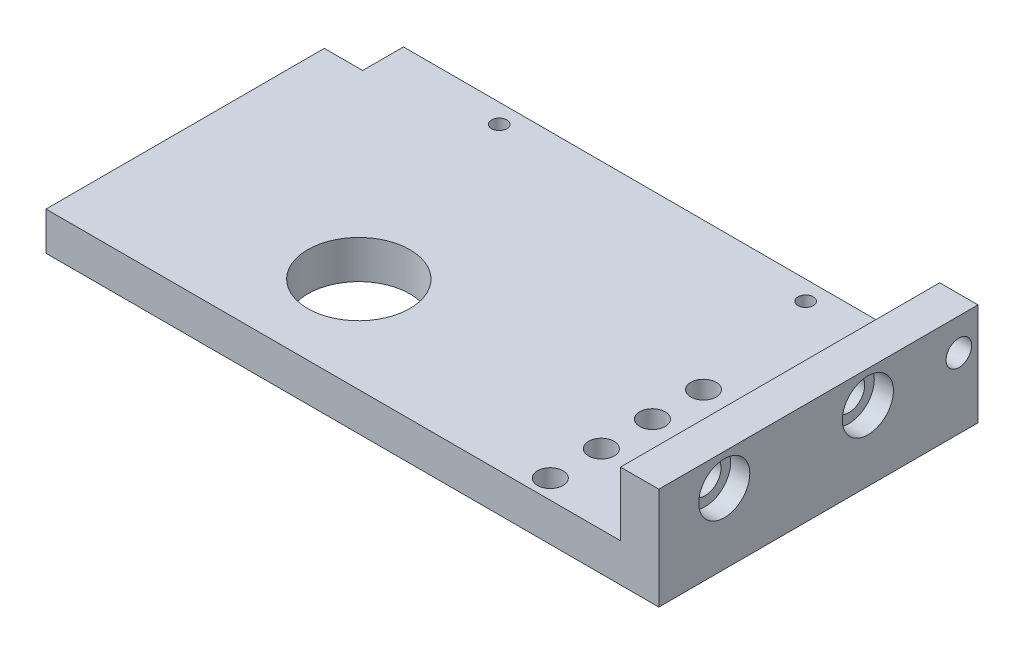
ISO-10303-21;
HEADER;
FILE_DESCRIPTION(('STEP AP214'),'2;1');
FILE_NAME('part.step','',(''),(''),'','','');
FILE_SCHEMA(('AUTOMOTIVE_DESIGN { 1 0 10303 214 1 1 1 1 }'));
ENDSEC;
DATA;
#1=APPLICATION_CONTEXT('core data for automotive mechanical design processes');
#2=APPLICATION_PROTOCOL_DEFINITION('international standard','automotive_design',2000,#1);
#3=PRODUCT_CONTEXT('',#1,'mechanical');
#4=PRODUCT('Part','Part','',(#3));
#5=PRODUCT_RELATED_PRODUCT_CATEGORY('part','',(#4));
#6=PRODUCT_DEFINITION_FORMATION('','',#4);
#7=PRODUCT_DEFINITION_CONTEXT('part definition',#1,'design');
#8=PRODUCT_DEFINITION('design','',#6,#7);
#9=PRODUCT_DEFINITION_SHAPE('','',#8);
#10=(LENGTH_UNIT() NAMED_UNIT(*) SI_UNIT(.MILLI.,.METRE.));
#11=(NAMED_UNIT(*) PLANE_ANGLE_UNIT() SI_UNIT($,.RADIAN.));
#12=(NAMED_UNIT(*) SI_UNIT($,.STERADIAN.) SOLID_ANGLE_UNIT());
#13=UNCERTAINTY_MEASURE_WITH_UNIT(LENGTH_MEASURE(1.E-05),#10,'distance_accuracy_value','');
#14=(GEOMETRIC_REPRESENTATION_CONTEXT(3) GLOBAL_UNCERTAINTY_ASSIGNED_CONTEXT((#13)) GLOBAL_UNIT_ASSIGNED_CONTEXT((#10,
#11,#12)) REPRESENTATION_CONTEXT('',''));
#15=CARTESIAN_POINT('',(0.,0.,0.));
#16=DIRECTION('',(0.,0.,1.));
#17=DIRECTION('',(1.,0.,0.));
#18=AXIS2_PLACEMENT_3D('',#15,#16,#17);
#19=CARTESIAN_POINT('',(13.5,8.,-12.5));
#20=DIRECTION('',(0.,-1.,0.));
#21=DIRECTION('',(0.,0.,-1.));
#22=AXIS2_PLACEMENT_3D('',#19,#20,#21);
#23=CYLINDRICAL_SURFACE('',#22,0.6);
#24=CARTESIAN_POINT('',(13.5,3.,-12.5));
#25=DIRECTION('',(0.,-1.,0.));
#26=DIRECTION('',(0.,0.,-1.));
#27=AXIS2_PLACEMENT_3D('',#24,#25,#26);
#28=CIRCLE('',#27,0.6);
#29=CARTESIAN_POINT('',(13.5,3.,-13.1));
#30=VERTEX_POINT('',#29);
#31=EDGE_CURVE('E152',#30,#30,#28,.T.);
#32=ORIENTED_EDGE('',*,*,#31,.F.);
#33=EDGE_LOOP('',(#32));
#34=FACE_BOUND('',#33,.T.);
#35=CARTESIAN_POINT('',(13.5,1.5,-12.5));
#36=DIRECTION('',(0.,-1.,0.));
#37=DIRECTION('',(0.,0.,-1.));
#38=AXIS2_PLACEMENT_3D('',#35,#36,#37);
#39=CIRCLE('',#38,0.6);
#40=CARTESIAN_POINT('',(13.5,1.5,-13.1));
#41=VERTEX_POINT('',#40);
#42=EDGE_CURVE('E156',#41,#41,#39,.F.);
#43=ORIENTED_EDGE('',*,*,#42,.F.);
#44=EDGE_LOOP('',(#43));
#45=FACE_BOUND('',#44,.T.);
#46=ADVANCED_FACE('F63',(#34,#45),#23,.F.);
#47=CARTESIAN_POINT('',(-10.5,8.,-12.5));
#48=DIRECTION('',(0.,-1.,0.));
#49=DIRECTION('',(0.,0.,-1.));
#50=AXIS2_PLACEMENT_3D('',#47,#48,#49);
#51=CYLINDRICAL_SURFACE('',#50,0.6);
#52=CARTESIAN_POINT('',(-10.5,3.,-12.5));
#53=DIRECTION('',(0.,-1.,0.));
#54=DIRECTION('',(0.,0.,-1.));
#55=AXIS2_PLACEMENT_3D('',#52,#53,#54);
#56=CIRCLE('',#55,0.6);
#57=CARTESIAN_POINT('',(-10.5,3.,-13.1));
#58=VERTEX_POINT('',#57);
#59=EDGE_CURVE('E155',#58,#58,#56,.T.);
#60=ORIENTED_EDGE('',*,*,#59,.F.);
#61=EDGE_LOOP('',(#60));
#62=FACE_BOUND('',#61,.T.);
#63=CARTESIAN_POINT('',(-10.5,1.5,-12.5));
#64=DIRECTION('',(0.,-1.,0.));
#65=DIRECTION('',(0.,0.,-1.));
#66=AXIS2_PLACEMENT_3D('',#63,#64,#65);
#67=CIRCLE('',#66,0.6);
#68=CARTESIAN_POINT('',(-10.5,1.5,-13.1));
#69=VERTEX_POINT('',#68);
#70=EDGE_CURVE('E160',#69,#69,#67,.F.);
#71=ORIENTED_EDGE('',*,*,#70,.F.);
#72=EDGE_LOOP('',(#71));
#73=FACE_BOUND('',#72,.T.);
#74=ADVANCED_FACE('F319',(#62,#73),#51,.F.);
#75=CARTESIAN_POINT('',(-22.5,5.50000000000001,-12.5));
#76=DIRECTION('',(1.,0.,0.));
#77=DIRECTION('',(0.,0.,-1.));
#78=AXIS2_PLACEMENT_3D('',#75,#76,#77);
#79=CYLINDRICAL_SURFACE('',#78,0.6);
#80=CARTESIAN_POINT('',(22.5,5.50000000000001,-12.5));
#81=DIRECTION('',(-1.,0.,0.));
#82=DIRECTION('',(0.,0.,1.));
#83=AXIS2_PLACEMENT_3D('',#80,#81,#82);
#84=CIRCLE('',#83,0.6);
#85=CARTESIAN_POINT('',(22.5,5.50000000000001,-11.9));
#86=VERTEX_POINT('',#85);
#87=EDGE_CURVE('E149',#86,#86,#84,.T.);
#88=ORIENTED_EDGE('',*,*,#87,.T.);
#89=EDGE_LOOP('',(#88));
#90=FACE_BOUND('',#89,.T.);
#91=CARTESIAN_POINT('',(24.,5.50000000000001,-12.5));
#92=DIRECTION('',(1.,0.,0.));
#93=DIRECTION('',(0.,0.,-1.));
#94=AXIS2_PLACEMENT_3D('',#91,#92,#93);
#95=CIRCLE('',#94,0.6);
#96=CARTESIAN_POINT('',(24.,5.50000000000001,-13.1));
#97=VERTEX_POINT('',#96);
#98=EDGE_CURVE('E147',#97,#97,#95,.F.);
#99=ORIENTED_EDGE('',*,*,#98,.F.);
#100=EDGE_LOOP('',(#99));
#101=FACE_BOUND('',#100,.T.);
#102=ADVANCED_FACE('F325',(#90,#101),#79,.F.);
#103=CARTESIAN_POINT('',(-22.5,5.50000004095702,5.87500000000672));
#104=DIRECTION('',(1.,0.,0.));
#105=DIRECTION('',(0.,0.,-1.));
#106=AXIS2_PLACEMENT_3D('',#103,#104,#105);
#107=CYLINDRICAL_SURFACE('',#106,1.25);
#108=CARTESIAN_POINT('',(22.5,5.50000004095702,5.87500000000672));
#109=DIRECTION('',(-1.,0.,0.));
#110=DIRECTION('',(0.,0.,1.));
#111=AXIS2_PLACEMENT_3D('',#108,#109,#110);
#112=CIRCLE('',#111,1.25);
#113=CARTESIAN_POINT('',(22.5,5.50000004095702,7.12500000000672));
#114=VERTEX_POINT('',#113);
#115=EDGE_CURVE('E146',#114,#114,#112,.T.);
#116=ORIENTED_EDGE('',*,*,#115,.T.);
#117=EDGE_LOOP('',(#116));
#118=FACE_BOUND('',#117,.T.);
#119=CARTESIAN_POINT('',(24.,5.50000004095702,5.87500000000672));
#120=DIRECTION('',(1.,0.,0.));
#121=DIRECTION('',(0.,0.,-1.));
#122=AXIS2_PLACEMENT_3D('',#119,#120,#121);
#123=CIRCLE('',#122,1.25);
#124=CARTESIAN_POINT('',(24.,5.50000004095702,4.62500000000671));
#125=VERTEX_POINT('',#124);
#126=EDGE_CURVE('E142',#125,#125,#123,.F.);
#127=ORIENTED_EDGE('',*,*,#126,.F.);
#128=EDGE_LOOP('',(#127));
#129=FACE_BOUND('',#128,.T.);
#130=ADVANCED_FACE('F345',(#118,#129),#107,.F.);
#131=CARTESIAN_POINT('',(-22.5,5.50000004095702,-5.37499999999329));
#132=DIRECTION('',(1.,0.,0.));
#133=DIRECTION('',(0.,0.,-1.));
#134=AXIS2_PLACEMENT_3D('',#131,#132,#133);
#135=CYLINDRICAL_SURFACE('',#134,1.25);
#136=CARTESIAN_POINT('',(22.5,5.50000004095702,-5.37499999999329));
#137=DIRECTION('',(-1.,0.,0.));
#138=DIRECTION('',(0.,0.,1.));
#139=AXIS2_PLACEMENT_3D('',#136,#137,#138);
#140=CIRCLE('',#139,1.25);
#141=CARTESIAN_POINT('',(22.5,5.50000004095702,-4.12499999999329));
#142=VERTEX_POINT('',#141);
#143=EDGE_CURVE('E233',#142,#142,#140,.T.);
#144=ORIENTED_EDGE('',*,*,#143,.T.);
#145=EDGE_LOOP('',(#144));
#146=FACE_BOUND('',#145,.T.);
#147=CARTESIAN_POINT('',(24.,5.50000004095702,-5.37499999999329));
#148=DIRECTION('',(1.,0.,0.));
#149=DIRECTION('',(0.,0.,-1.));
#150=AXIS2_PLACEMENT_3D('',#147,#148,#149);
#151=CIRCLE('',#150,1.25);
#152=CARTESIAN_POINT('',(24.,5.50000004095702,-6.62499999999329));
#153=VERTEX_POINT('',#152);
#154=EDGE_CURVE('E139',#153,#153,#151,.F.);
#155=ORIENTED_EDGE('',*,*,#154,.F.);
#156=EDGE_LOOP('',(#155));
#157=FACE_BOUND('',#156,.T.);
#158=ADVANCED_FACE('F358',(#146,#157),#135,.F.);
#159=CARTESIAN_POINT('',(-22.5,3.,11.));
#160=DIRECTION('',(0.,0.,-1.));
#161=DIRECTION('',(-1.,0.,0.));
#162=AXIS2_PLACEMENT_3D('',#159,#160,#161);
#163=PLANE('',#162);
#164=DIRECTION('',(1.,0.,0.));
#165=VECTOR('',#164,1.);
#166=CARTESIAN_POINT('',(-22.5,0.,11.));
#167=LINE('',#166,#165);
#168=CARTESIAN_POINT('',(-22.5,0.,11.));
#169=VERTEX_POINT('',#168);
#170=CARTESIAN_POINT('',(25.5,0.,11.));
#171=VERTEX_POINT('',#170);
#172=EDGE_CURVE('E254',#169,#171,#167,.T.);
#173=ORIENTED_EDGE('',*,*,#172,.T.);
#174=DIRECTION('',(0.,-1.,0.));
#175=VECTOR('',#174,1.);
#176=CARTESIAN_POINT('',(25.5,0.,11.));
#177=LINE('',#176,#175);
#178=CARTESIAN_POINT('',(25.5,8.,11.));
#179=VERTEX_POINT('',#178);
#180=EDGE_CURVE('E236',#179,#171,#177,.T.);
#181=ORIENTED_EDGE('',*,*,#180,.F.);
#182=DIRECTION('',(-1.,0.,0.));
#183=VECTOR('',#182,1.);
#184=CARTESIAN_POINT('',(25.5,8.,11.));
#185=LINE('',#184,#183);
#186=CARTESIAN_POINT('',(22.5,8.,11.));
#187=VERTEX_POINT('',#186);
#188=EDGE_CURVE('E248',#179,#187,#185,.T.);
#189=ORIENTED_EDGE('',*,*,#188,.T.);
#190=DIRECTION('',(0.,-1.,0.));
#191=VECTOR('',#190,1.);
#192=CARTESIAN_POINT('',(22.5,0.,11.));
#193=LINE('',#192,#191);
#194=CARTESIAN_POINT('',(22.5,3.,11.));
#195=VERTEX_POINT('',#194);
#196=EDGE_CURVE('E109',#187,#195,#193,.T.);
#197=ORIENTED_EDGE('',*,*,#196,.T.);
#198=DIRECTION('',(1.,0.,0.));
#199=VECTOR('',#198,1.);
#200=CARTESIAN_POINT('',(-22.5,3.,11.));
#201=LINE('',#200,#199);
#202=CARTESIAN_POINT('',(-22.5,3.,11.));
#203=VERTEX_POINT('',#202);
#204=EDGE_CURVE('E118',#203,#195,#201,.T.);
#205=ORIENTED_EDGE('',*,*,#204,.F.);
#206=DIRECTION('',(0.,-1.,0.));
#207=VECTOR('',#206,1.);
#208=CARTESIAN_POINT('',(-22.5,3.,11.));
#209=LINE('',#208,#207);
#210=EDGE_CURVE('E73',#203,#169,#209,.T.);
#211=ORIENTED_EDGE('',*,*,#210,.T.);
#212=EDGE_LOOP('',(#173,#181,#189,#197,#205,#211));
#213=FACE_BOUND('',#212,.T.);
#214=ADVANCED_FACE('F262',(#213),#163,.F.);
#215=CARTESIAN_POINT('',(-22.5,3.,11.));
#216=DIRECTION('',(-1.,0.,0.));
#217=DIRECTION('',(0.,0.,1.));
#218=AXIS2_PLACEMENT_3D('',#215,#216,#217);
#219=PLANE('',#218);
#220=DIRECTION('',(0.,-1.,0.));
#221=VECTOR('',#220,1.);
#222=CARTESIAN_POINT('',(-22.5,8.,-10.8));
#223=LINE('',#222,#221);
#224=CARTESIAN_POINT('',(-22.5,3.,-10.8));
#225=VERTEX_POINT('',#224);
#226=CARTESIAN_POINT('',(-22.5,0.,-10.8));
#227=VERTEX_POINT('',#226);
#228=EDGE_CURVE('E208',#225,#227,#223,.T.);
#229=ORIENTED_EDGE('',*,*,#228,.T.);
#230=DIRECTION('',(0.,0.,-1.));
#231=VECTOR('',#230,1.);
#232=CARTESIAN_POINT('',(-22.5,0.,11.));
#233=LINE('',#232,#231);
#234=EDGE_CURVE('E128',#169,#227,#233,.T.);
#235=ORIENTED_EDGE('',*,*,#234,.F.);
#236=ORIENTED_EDGE('',*,*,#210,.F.);
#237=DIRECTION('',(0.,0.,-1.));
#238=VECTOR('',#237,1.);
#239=CARTESIAN_POINT('',(-22.5,3.,11.));
#240=LINE('',#239,#238);
#241=EDGE_CURVE('E119',#203,#225,#240,.T.);
#242=ORIENTED_EDGE('',*,*,#241,.T.);
#243=EDGE_LOOP('',(#229,#235,#236,#242));
#244=FACE_BOUND('',#243,.T.);
#245=ADVANCED_FACE('F271',(#244),#219,.T.);
#246=CARTESIAN_POINT('',(0.,0.,0.));
#247=DIRECTION('',(0.,-1.,0.));
#248=DIRECTION('',(0.,0.,-1.));
#249=AXIS2_PLACEMENT_3D('',#246,#247,#248);
#250=PLANE('',#249);
#251=CARTESIAN_POINT('',(-5.49999999999998,0.,3.5));
#252=DIRECTION('',(0.,-1.,0.));
#253=DIRECTION('',(0.,0.,-1.));
#254=AXIS2_PLACEMENT_3D('',#251,#252,#253);
#255=CIRCLE('',#254,4.);
#256=CARTESIAN_POINT('',(-5.49999999999998,0.,-0.499999999999996));
#257=VERTEX_POINT('',#256);
#258=EDGE_CURVE('E170',#257,#257,#255,.T.);
#259=ORIENTED_EDGE('',*,*,#258,.F.);
#260=EDGE_LOOP('',(#259));
#261=FACE_BOUND('',#260,.T.);
#262=CARTESIAN_POINT('',(15.5,0.,9.50000000000001));
#263=DIRECTION('',(0.,-1.,0.));
#264=DIRECTION('',(0.,0.,-1.));
#265=AXIS2_PLACEMENT_3D('',#262,#263,#264);
#266=CIRCLE('',#265,1.);
#267=CARTESIAN_POINT('',(15.5,0.,8.5));
#268=VERTEX_POINT('',#267);
#269=EDGE_CURVE('E571',#268,#268,#266,.T.);
#270=ORIENTED_EDGE('',*,*,#269,.F.);
#271=EDGE_LOOP('',(#270));
#272=FACE_BOUND('',#271,.T.);
#273=CARTESIAN_POINT('',(15.5,0.,5.5));
#274=DIRECTION('',(0.,-1.,0.));
#275=DIRECTION('',(0.,0.,-1.));
#276=AXIS2_PLACEMENT_3D('',#273,#274,#275);
#277=CIRCLE('',#276,1.);
#278=CARTESIAN_POINT('',(15.5,0.,4.5));
#279=VERTEX_POINT('',#278);
#280=EDGE_CURVE('E574',#279,#279,#277,.T.);
#281=ORIENTED_EDGE('',*,*,#280,.F.);
#282=EDGE_LOOP('',(#281));
#283=FACE_BOUND('',#282,.T.);
#284=CARTESIAN_POINT('',(15.5,0.,1.5));
#285=DIRECTION('',(0.,-1.,0.));
#286=DIRECTION('',(0.,0.,-1.));
#287=AXIS2_PLACEMENT_3D('',#284,#285,#286);
#288=CIRCLE('',#287,1.);
#289=CARTESIAN_POINT('',(15.5,0.,0.500000000000001));
#290=VERTEX_POINT('',#289);
#291=EDGE_CURVE('E579',#290,#290,#288,.T.);
#292=ORIENTED_EDGE('',*,*,#291,.F.);
#293=EDGE_LOOP('',(#292));
#294=FACE_BOUND('',#293,.T.);
#295=CARTESIAN_POINT('',(15.5,0.,-2.5));
#296=DIRECTION('',(0.,-1.,0.));
#297=DIRECTION('',(0.,0.,-1.));
#298=AXIS2_PLACEMENT_3D('',#295,#296,#297);
#299=CIRCLE('',#298,1.);
#300=CARTESIAN_POINT('',(15.5,0.,-3.5));
#301=VERTEX_POINT('',#300);
#302=EDGE_CURVE('E582',#301,#301,#299,.T.);
#303=ORIENTED_EDGE('',*,*,#302,.F.);
#304=EDGE_LOOP('',(#303));
#305=FACE_BOUND('',#304,.T.);
#306=CARTESIAN_POINT('',(21.,0.,4.75));
#307=DIRECTION('',(0.,-1.,0.));
#308=DIRECTION('',(0.,0.,-1.));
#309=AXIS2_PLACEMENT_3D('',#306,#307,#308);
#310=CIRCLE('',#309,0.350000000000001);
#311=CARTESIAN_POINT('',(21.,0.,4.4));
#312=VERTEX_POINT('',#311);
#313=EDGE_CURVE('E189',#312,#312,#310,.T.);
#314=ORIENTED_EDGE('',*,*,#313,.F.);
#315=EDGE_LOOP('',(#314));
#316=FACE_BOUND('',#315,.T.);
#317=CARTESIAN_POINT('',(21.,0.,-7.75));
#318=DIRECTION('',(0.,-1.,0.));
#319=DIRECTION('',(0.,0.,-1.));
#320=AXIS2_PLACEMENT_3D('',#317,#318,#319);
#321=CIRCLE('',#320,0.350000000000001);
#322=CARTESIAN_POINT('',(21.,0.,-8.1));
#323=VERTEX_POINT('',#322);
#324=EDGE_CURVE('E184',#323,#323,#321,.T.);
#325=ORIENTED_EDGE('',*,*,#324,.F.);
#326=EDGE_LOOP('',(#325));
#327=FACE_BOUND('',#326,.T.);
#328=CARTESIAN_POINT('',(-10.5,0.,-12.5));
#329=DIRECTION('',(0.,-1.,0.));
#330=DIRECTION('',(0.,0.,-1.));
#331=AXIS2_PLACEMENT_3D('',#328,#329,#330);
#332=CIRCLE('',#331,1.);
#333=CARTESIAN_POINT('',(-10.5,0.,-13.5));
#334=VERTEX_POINT('',#333);
#335=EDGE_CURVE('E195',#334,#334,#332,.T.);
#336=ORIENTED_EDGE('',*,*,#335,.F.);
#337=EDGE_LOOP('',(#336));
#338=FACE_BOUND('',#337,.T.);
#339=CARTESIAN_POINT('',(13.5,0.,-12.5));
#340=DIRECTION('',(0.,-1.,0.));
#341=DIRECTION('',(0.,0.,-1.));
#342=AXIS2_PLACEMENT_3D('',#339,#340,#341);
#343=CIRCLE('',#342,0.999999999999999);
#344=CARTESIAN_POINT('',(13.5,0.,-13.5));
#345=VERTEX_POINT('',#344);
#346=EDGE_CURVE('E198',#345,#345,#343,.T.);
#347=ORIENTED_EDGE('',*,*,#346,.F.);
#348=EDGE_LOOP('',(#347));
#349=FACE_BOUND('',#348,.T.);
#350=DIRECTION('',(-1.,0.,0.));
#351=VECTOR('',#350,1.);
#352=CARTESIAN_POINT('',(-22.5,0.,-10.8));
#353=LINE('',#352,#351);
#354=CARTESIAN_POINT('',(-19.5,0.,-10.8));
#355=VERTEX_POINT('',#354);
#356=EDGE_CURVE('E159',#355,#227,#353,.T.);
#357=ORIENTED_EDGE('',*,*,#356,.F.);
#358=DIRECTION('',(0.,0.,-1.));
#359=VECTOR('',#358,1.);
#360=CARTESIAN_POINT('',(-19.5,0.,-11.));
#361=LINE('',#360,#359);
#362=CARTESIAN_POINT('',(-19.5,0.,-14.));
#363=VERTEX_POINT('',#362);
#364=EDGE_CURVE('E134',#355,#363,#361,.T.);
#365=ORIENTED_EDGE('',*,*,#364,.T.);
#366=DIRECTION('',(-1.,0.,0.));
#367=VECTOR('',#366,1.);
#368=CARTESIAN_POINT('',(22.5,0.,-14.));
#369=LINE('',#368,#367);
#370=CARTESIAN_POINT('',(25.5,0.,-14.));
#371=VERTEX_POINT('',#370);
#372=EDGE_CURVE('E130',#371,#363,#369,.T.);
#373=ORIENTED_EDGE('',*,*,#372,.F.);
#374=DIRECTION('',(0.,0.,-1.));
#375=VECTOR('',#374,1.);
#376=CARTESIAN_POINT('',(25.5,0.,11.));
#377=LINE('',#376,#375);
#378=EDGE_CURVE('E239',#171,#371,#377,.T.);
#379=ORIENTED_EDGE('',*,*,#378,.F.);
#380=ORIENTED_EDGE('',*,*,#172,.F.);
#381=ORIENTED_EDGE('',*,*,#234,.T.);
#382=EDGE_LOOP('',(#357,#365,#373,#379,#380,#381));
#383=FACE_BOUND('',#382,.T.);
#384=ADVANCED_FACE('F268',(#261,#272,#283,#294,#305,#316,#327,#338,#349,#383),#250,.T.);
#385=CARTESIAN_POINT('',(0.,3.,0.));
#386=DIRECTION('',(0.,-1.,0.));
#387=DIRECTION('',(0.,0.,-1.));
#388=AXIS2_PLACEMENT_3D('',#385,#386,#387);
#389=PLANE('',#388);
#390=CARTESIAN_POINT('',(-5.49999999999998,3.,3.5));
#391=DIRECTION('',(0.,-1.,0.));
#392=DIRECTION('',(0.,0.,-1.));
#393=AXIS2_PLACEMENT_3D('',#390,#391,#392);
#394=CIRCLE('',#393,4.);
#395=CARTESIAN_POINT('',(-5.49999999999998,3.,-0.499999999999996));
#396=VERTEX_POINT('',#395);
#397=EDGE_CURVE('E67',#396,#396,#394,.T.);
#398=ORIENTED_EDGE('',*,*,#397,.T.);
#399=EDGE_LOOP('',(#398));
#400=FACE_BOUND('',#399,.T.);
#401=CARTESIAN_POINT('',(15.5,3.,9.50000000000001));
#402=DIRECTION('',(0.,-1.,0.));
#403=DIRECTION('',(0.,0.,-1.));
#404=AXIS2_PLACEMENT_3D('',#401,#402,#403);
#405=CIRCLE('',#404,1.);
#406=CARTESIAN_POINT('',(15.5,3.,8.5));
#407=VERTEX_POINT('',#406);
#408=EDGE_CURVE('E175',#407,#407,#405,.T.);
#409=ORIENTED_EDGE('',*,*,#408,.T.);
#410=EDGE_LOOP('',(#409));
#411=FACE_BOUND('',#410,.T.);
#412=CARTESIAN_POINT('',(15.5,3.,5.5));
#413=DIRECTION('',(0.,-1.,0.));
#414=DIRECTION('',(0.,0.,-1.));
#415=AXIS2_PLACEMENT_3D('',#412,#413,#414);
#416=CIRCLE('',#415,1.);
#417=CARTESIAN_POINT('',(15.5,3.,4.5));
#418=VERTEX_POINT('',#417);
#419=EDGE_CURVE('E173',#418,#418,#416,.T.);
#420=ORIENTED_EDGE('',*,*,#419,.T.);
#421=EDGE_LOOP('',(#420));
#422=FACE_BOUND('',#421,.T.);
#423=CARTESIAN_POINT('',(15.5,3.,1.5));
#424=DIRECTION('',(0.,-1.,0.));
#425=DIRECTION('',(0.,0.,-1.));
#426=AXIS2_PLACEMENT_3D('',#423,#424,#425);
#427=CIRCLE('',#426,1.);
#428=CARTESIAN_POINT('',(15.5,3.,0.500000000000001));
#429=VERTEX_POINT('',#428);
#430=EDGE_CURVE('E169',#429,#429,#427,.T.);
#431=ORIENTED_EDGE('',*,*,#430,.T.);
#432=EDGE_LOOP('',(#431));
#433=FACE_BOUND('',#432,.T.);
#434=CARTESIAN_POINT('',(15.5,3.,-2.5));
#435=DIRECTION('',(0.,-1.,0.));
#436=DIRECTION('',(0.,0.,-1.));
#437=AXIS2_PLACEMENT_3D('',#434,#435,#436);
#438=CIRCLE('',#437,1.);
#439=CARTESIAN_POINT('',(15.5,3.,-3.5));
#440=VERTEX_POINT('',#439);
#441=EDGE_CURVE('E166',#440,#440,#438,.T.);
#442=ORIENTED_EDGE('',*,*,#441,.T.);
#443=EDGE_LOOP('',(#442));
#444=FACE_BOUND('',#443,.T.);
#445=CARTESIAN_POINT('',(21.,3.,4.75));
#446=DIRECTION('',(0.,-1.,0.));
#447=DIRECTION('',(0.,0.,-1.));
#448=AXIS2_PLACEMENT_3D('',#445,#446,#447);
#449=CIRCLE('',#448,0.350000000000001);
#450=CARTESIAN_POINT('',(21.,3.,4.4));
#451=VERTEX_POINT('',#450);
#452=EDGE_CURVE('E204',#451,#451,#449,.T.);
#453=ORIENTED_EDGE('',*,*,#452,.T.);
#454=EDGE_LOOP('',(#453));
#455=FACE_BOUND('',#454,.T.);
#456=CARTESIAN_POINT('',(21.,3.,-7.75));
#457=DIRECTION('',(0.,-1.,0.));
#458=DIRECTION('',(0.,0.,-1.));
#459=AXIS2_PLACEMENT_3D('',#456,#457,#458);
#460=CIRCLE('',#459,0.350000000000001);
#461=CARTESIAN_POINT('',(21.,3.,-8.1));
#462=VERTEX_POINT('',#461);
#463=EDGE_CURVE('E180',#462,#462,#460,.T.);
#464=ORIENTED_EDGE('',*,*,#463,.T.);
#465=EDGE_LOOP('',(#464));
#466=FACE_BOUND('',#465,.T.);
#467=ORIENTED_EDGE('',*,*,#59,.T.);
#468=EDGE_LOOP('',(#467));
#469=FACE_BOUND('',#468,.T.);
#470=ORIENTED_EDGE('',*,*,#31,.T.);
#471=EDGE_LOOP('',(#470));
#472=FACE_BOUND('',#471,.T.);
#473=DIRECTION('',(0.,0.,-1.));
#474=VECTOR('',#473,1.);
#475=CARTESIAN_POINT('',(-19.5,3.,-11.));
#476=LINE('',#475,#474);
#477=CARTESIAN_POINT('',(-19.5,3.,-10.8));
#478=VERTEX_POINT('',#477);
#479=CARTESIAN_POINT('',(-19.5,3.,-14.));
#480=VERTEX_POINT('',#479);
#481=EDGE_CURVE('E126',#478,#480,#476,.T.);
#482=ORIENTED_EDGE('',*,*,#481,.F.);
#483=DIRECTION('',(-1.,0.,0.));
#484=VECTOR('',#483,1.);
#485=CARTESIAN_POINT('',(0.,3.,-10.8));
#486=LINE('',#485,#484);
#487=EDGE_CURVE('E12',#478,#225,#486,.T.);
#488=ORIENTED_EDGE('',*,*,#487,.T.);
#489=ORIENTED_EDGE('',*,*,#241,.F.);
#490=ORIENTED_EDGE('',*,*,#204,.T.);
#491=DIRECTION('',(0.,0.,-1.));
#492=VECTOR('',#491,1.);
#493=CARTESIAN_POINT('',(22.5,3.,11.));
#494=LINE('',#493,#492);
#495=CARTESIAN_POINT('',(22.5,3.,-14.));
#496=VERTEX_POINT('',#495);
#497=EDGE_CURVE('E100',#195,#496,#494,.T.);
#498=ORIENTED_EDGE('',*,*,#497,.T.);
#499=DIRECTION('',(-1.,0.,0.));
#500=VECTOR('',#499,1.);
#501=CARTESIAN_POINT('',(22.5,3.,-14.));
#502=LINE('',#501,#500);
#503=EDGE_CURVE('E115',#496,#480,#502,.T.);
#504=ORIENTED_EDGE('',*,*,#503,.T.);
#505=EDGE_LOOP('',(#482,#488,#489,#490,#498,#504));
#506=FACE_BOUND('',#505,.T.);
#507=ADVANCED_FACE('F114',(#400,#411,#422,#433,#444,#455,#466,#469,#472,#506),#389,.F.);
#508=CARTESIAN_POINT('',(22.5,3.,-14.));
#509=DIRECTION('',(0.,0.,1.));
#510=DIRECTION('',(1.,0.,0.));
#511=AXIS2_PLACEMENT_3D('',#508,#509,#510);
#512=PLANE('',#511);
#513=ORIENTED_EDGE('',*,*,#372,.T.);
#514=DIRECTION('',(0.,-1.,0.));
#515=VECTOR('',#514,1.);
#516=CARTESIAN_POINT('',(-19.5,3.,-14.));
#517=LINE('',#516,#515);
#518=EDGE_CURVE('E124',#480,#363,#517,.T.);
#519=ORIENTED_EDGE('',*,*,#518,.F.);
#520=ORIENTED_EDGE('',*,*,#503,.F.);
#521=DIRECTION('',(0.,1.,0.));
#522=VECTOR('',#521,1.);
#523=CARTESIAN_POINT('',(22.5,0.,-14.));
#524=LINE('',#523,#522);
#525=CARTESIAN_POINT('',(22.5,8.,-14.));
#526=VERTEX_POINT('',#525);
#527=EDGE_CURVE('E96',#496,#526,#524,.T.);
#528=ORIENTED_EDGE('',*,*,#527,.T.);
#529=DIRECTION('',(-1.,0.,0.));
#530=VECTOR('',#529,1.);
#531=CARTESIAN_POINT('',(25.5,8.,-14.));
#532=LINE('',#531,#530);
#533=CARTESIAN_POINT('',(25.5,8.,-14.));
#534=VERTEX_POINT('',#533);
#535=EDGE_CURVE('E137',#534,#526,#532,.T.);
#536=ORIENTED_EDGE('',*,*,#535,.F.);
#537=DIRECTION('',(0.,1.,0.));
#538=VECTOR('',#537,1.);
#539=CARTESIAN_POINT('',(25.5,0.,-14.));
#540=LINE('',#539,#538);
#541=EDGE_CURVE('E242',#371,#534,#540,.T.);
#542=ORIENTED_EDGE('',*,*,#541,.F.);
#543=EDGE_LOOP('',(#513,#519,#520,#528,#536,#542));
#544=FACE_BOUND('',#543,.T.);
#545=ADVANCED_FACE('F122',(#544),#512,.F.);
#546=CARTESIAN_POINT('',(-19.5,3.,-11.));
#547=DIRECTION('',(-1.,0.,0.));
#548=DIRECTION('',(0.,0.,1.));
#549=AXIS2_PLACEMENT_3D('',#546,#547,#548);
#550=PLANE('',#549);
#551=ORIENTED_EDGE('',*,*,#364,.F.);
#552=DIRECTION('',(0.,-1.,0.));
#553=VECTOR('',#552,1.);
#554=CARTESIAN_POINT('',(-19.5,8.,-10.8));
#555=LINE('',#554,#553);
#556=EDGE_CURVE('E207',#478,#355,#555,.T.);
#557=ORIENTED_EDGE('',*,*,#556,.F.);
#558=ORIENTED_EDGE('',*,*,#481,.T.);
#559=ORIENTED_EDGE('',*,*,#518,.T.);
#560=EDGE_LOOP('',(#551,#557,#558,#559));
#561=FACE_BOUND('',#560,.T.);
#562=ADVANCED_FACE('F65',(#561),#550,.T.);
#563=CARTESIAN_POINT('',(22.5,0.,0.));
#564=DIRECTION('',(-1.,0.,0.));
#565=DIRECTION('',(0.,0.,1.));
#566=AXIS2_PLACEMENT_3D('',#563,#564,#565);
#567=PLANE('',#566);
#568=ORIENTED_EDGE('',*,*,#87,.F.);
#569=EDGE_LOOP('',(#568));
#570=FACE_BOUND('',#569,.T.);
#571=ORIENTED_EDGE('',*,*,#143,.F.);
#572=EDGE_LOOP('',(#571));
#573=FACE_BOUND('',#572,.T.);
#574=ORIENTED_EDGE('',*,*,#115,.F.);
#575=EDGE_LOOP('',(#574));
#576=FACE_BOUND('',#575,.T.);
#577=ORIENTED_EDGE('',*,*,#497,.F.);
#578=ORIENTED_EDGE('',*,*,#196,.F.);
#579=DIRECTION('',(0.,0.,1.));
#580=VECTOR('',#579,1.);
#581=CARTESIAN_POINT('',(22.5,8.,11.));
#582=LINE('',#581,#580);
#583=EDGE_CURVE('E104',#526,#187,#582,.T.);
#584=ORIENTED_EDGE('',*,*,#583,.F.);
#585=ORIENTED_EDGE('',*,*,#527,.F.);
#586=EDGE_LOOP('',(#577,#578,#584,#585));
#587=FACE_BOUND('',#586,.T.);
#588=ADVANCED_FACE('F98',(#570,#573,#576,#587),#567,.T.);
#589=CARTESIAN_POINT('',(25.5,8.,11.));
#590=DIRECTION('',(0.,-1.,0.));
#591=DIRECTION('',(0.,0.,-1.));
#592=AXIS2_PLACEMENT_3D('',#589,#590,#591);
#593=PLANE('',#592);
#594=ORIENTED_EDGE('',*,*,#583,.T.);
#595=ORIENTED_EDGE('',*,*,#188,.F.);
#596=DIRECTION('',(0.,0.,1.));
#597=VECTOR('',#596,1.);
#598=CARTESIAN_POINT('',(25.5,8.,11.));
#599=LINE('',#598,#597);
#600=EDGE_CURVE('E245',#534,#179,#599,.T.);
#601=ORIENTED_EDGE('',*,*,#600,.F.);
#602=ORIENTED_EDGE('',*,*,#535,.T.);
#603=EDGE_LOOP('',(#594,#595,#601,#602));
#604=FACE_BOUND('',#603,.T.);
#605=ADVANCED_FACE('F299',(#604),#593,.F.);
#606=CARTESIAN_POINT('',(25.5,0.,0.));
#607=DIRECTION('',(-1.,0.,0.));
#608=DIRECTION('',(0.,0.,1.));
#609=AXIS2_PLACEMENT_3D('',#606,#607,#608);
#610=PLANE('',#609);
#611=CARTESIAN_POINT('',(25.5,5.50000000000001,-12.5));
#612=DIRECTION('',(1.,0.,0.));
#613=DIRECTION('',(0.,0.,-1.));
#614=AXIS2_PLACEMENT_3D('',#611,#612,#613);
#615=CIRCLE('',#614,1.);
#616=CARTESIAN_POINT('',(25.5,5.50000000000001,-13.5));
#617=VERTEX_POINT('',#616);
#618=EDGE_CURVE('E211',#617,#617,#615,.T.);
#619=ORIENTED_EDGE('',*,*,#618,.F.);
#620=EDGE_LOOP('',(#619));
#621=FACE_BOUND('',#620,.T.);
#622=CARTESIAN_POINT('',(25.5,5.50000004095702,-5.37499999999329));
#623=DIRECTION('',(1.,0.,0.));
#624=DIRECTION('',(0.,0.,-1.));
#625=AXIS2_PLACEMENT_3D('',#622,#623,#624);
#626=CIRCLE('',#625,2.);
#627=CARTESIAN_POINT('',(25.5,5.50000004095702,-7.37499999999329));
#628=VERTEX_POINT('',#627);
#629=EDGE_CURVE('E223',#628,#628,#626,.T.);
#630=ORIENTED_EDGE('',*,*,#629,.F.);
#631=EDGE_LOOP('',(#630));
#632=FACE_BOUND('',#631,.T.);
#633=CARTESIAN_POINT('',(25.5,5.50000004095702,5.87500000000672));
#634=DIRECTION('',(1.,0.,0.));
#635=DIRECTION('',(0.,0.,-1.));
#636=AXIS2_PLACEMENT_3D('',#633,#634,#635);
#637=CIRCLE('',#636,2.);
#638=CARTESIAN_POINT('',(25.5,5.50000004095702,3.87500000000671));
#639=VERTEX_POINT('',#638);
#640=EDGE_CURVE('E226',#639,#639,#637,.T.);
#641=ORIENTED_EDGE('',*,*,#640,.F.);
#642=EDGE_LOOP('',(#641));
#643=FACE_BOUND('',#642,.T.);
#644=ORIENTED_EDGE('',*,*,#180,.T.);
#645=ORIENTED_EDGE('',*,*,#378,.T.);
#646=ORIENTED_EDGE('',*,*,#541,.T.);
#647=ORIENTED_EDGE('',*,*,#600,.T.);
#648=EDGE_LOOP('',(#644,#645,#646,#647));
#649=FACE_BOUND('',#648,.T.);
#650=ADVANCED_FACE('F300',(#621,#632,#643,#649),#610,.F.);
#651=CARTESIAN_POINT('',(24.,5.50000004095702,-5.37499999999329));
#652=DIRECTION('',(1.,0.,0.));
#653=DIRECTION('',(0.,0.,-1.));
#654=AXIS2_PLACEMENT_3D('',#651,#652,#653);
#655=PLANE('',#654);
#656=CARTESIAN_POINT('',(24.,5.50000004095702,-5.37499999999329));
#657=DIRECTION('',(1.,0.,0.));
#658=DIRECTION('',(0.,0.,-1.));
#659=AXIS2_PLACEMENT_3D('',#656,#657,#658);
#660=CIRCLE('',#659,2.);
#661=CARTESIAN_POINT('',(24.,5.50000004095702,-7.37499999999329));
#662=VERTEX_POINT('',#661);
#663=EDGE_CURVE('E143',#662,#662,#660,.T.);
#664=ORIENTED_EDGE('',*,*,#663,.T.);
#665=EDGE_LOOP('',(#664));
#666=FACE_BOUND('',#665,.T.);
#667=ORIENTED_EDGE('',*,*,#154,.T.);
#668=EDGE_LOOP('',(#667));
#669=FACE_BOUND('',#668,.T.);
#670=ADVANCED_FACE('F303',(#666,#669),#655,.T.);
#671=CARTESIAN_POINT('',(24.,5.50000004095702,-5.37499999999329));
#672=DIRECTION('',(1.,0.,0.));
#673=DIRECTION('',(0.,0.,-1.));
#674=AXIS2_PLACEMENT_3D('',#671,#672,#673);
#675=CYLINDRICAL_SURFACE('',#674,2.);
#676=ORIENTED_EDGE('',*,*,#663,.F.);
#677=EDGE_LOOP('',(#676));
#678=FACE_BOUND('',#677,.T.);
#679=ORIENTED_EDGE('',*,*,#629,.T.);
#680=EDGE_LOOP('',(#679));
#681=FACE_BOUND('',#680,.T.);
#682=ADVANCED_FACE('F310',(#678,#681),#675,.F.);
#683=CARTESIAN_POINT('',(24.,5.50000004095702,5.87500000000672));
#684=DIRECTION('',(1.,0.,0.));
#685=DIRECTION('',(0.,0.,-1.));
#686=AXIS2_PLACEMENT_3D('',#683,#684,#685);
#687=PLANE('',#686);
#688=CARTESIAN_POINT('',(24.,5.50000004095702,5.87500000000672));
#689=DIRECTION('',(1.,0.,0.));
#690=DIRECTION('',(0.,0.,-1.));
#691=AXIS2_PLACEMENT_3D('',#688,#689,#690);
#692=CIRCLE('',#691,2.);
#693=CARTESIAN_POINT('',(24.,5.50000004095702,3.87500000000671));
#694=VERTEX_POINT('',#693);
#695=EDGE_CURVE('E220',#694,#694,#692,.T.);
#696=ORIENTED_EDGE('',*,*,#695,.T.);
#697=EDGE_LOOP('',(#696));
#698=FACE_BOUND('',#697,.T.);
#699=ORIENTED_EDGE('',*,*,#126,.T.);
#700=EDGE_LOOP('',(#699));
#701=FACE_BOUND('',#700,.T.);
#702=ADVANCED_FACE('F350',(#698,#701),#687,.T.);
#703=CARTESIAN_POINT('',(24.,5.50000004095702,5.87500000000672));
#704=DIRECTION('',(1.,0.,0.));
#705=DIRECTION('',(0.,0.,-1.));
#706=AXIS2_PLACEMENT_3D('',#703,#704,#705);
#707=CYLINDRICAL_SURFACE('',#706,2.);
#708=ORIENTED_EDGE('',*,*,#695,.F.);
#709=EDGE_LOOP('',(#708));
#710=FACE_BOUND('',#709,.T.);
#711=ORIENTED_EDGE('',*,*,#640,.T.);
#712=EDGE_LOOP('',(#711));
#713=FACE_BOUND('',#712,.T.);
#714=ADVANCED_FACE('F339',(#710,#713),#707,.F.);
#715=CARTESIAN_POINT('',(24.,5.50000000000001,-12.5));
#716=DIRECTION('',(1.,0.,0.));
#717=DIRECTION('',(0.,0.,-1.));
#718=AXIS2_PLACEMENT_3D('',#715,#716,#717);
#719=PLANE('',#718);
#720=CARTESIAN_POINT('',(24.,5.50000000000001,-12.5));
#721=DIRECTION('',(1.,0.,0.));
#722=DIRECTION('',(0.,0.,-1.));
#723=AXIS2_PLACEMENT_3D('',#720,#721,#722);
#724=CIRCLE('',#723,1.);
#725=CARTESIAN_POINT('',(24.,5.50000000000001,-13.5));
#726=VERTEX_POINT('',#725);
#727=EDGE_CURVE('E150',#726,#726,#724,.T.);
#728=ORIENTED_EDGE('',*,*,#727,.T.);
#729=EDGE_LOOP('',(#728));
#730=FACE_BOUND('',#729,.T.);
#731=ORIENTED_EDGE('',*,*,#98,.T.);
#732=EDGE_LOOP('',(#731));
#733=FACE_BOUND('',#732,.T.);
#734=ADVANCED_FACE('F336',(#730,#733),#719,.T.);
#735=CARTESIAN_POINT('',(24.,5.50000000000001,-12.5));
#736=DIRECTION('',(1.,0.,0.));
#737=DIRECTION('',(0.,0.,-1.));
#738=AXIS2_PLACEMENT_3D('',#735,#736,#737);
#739=CYLINDRICAL_SURFACE('',#738,1.);
#740=ORIENTED_EDGE('',*,*,#727,.F.);
#741=EDGE_LOOP('',(#740));
#742=FACE_BOUND('',#741,.T.);
#743=ORIENTED_EDGE('',*,*,#618,.T.);
#744=EDGE_LOOP('',(#743));
#745=FACE_BOUND('',#744,.T.);
#746=ADVANCED_FACE('F335',(#742,#745),#739,.F.);
#747=CARTESIAN_POINT('',(-22.5,8.,-10.8));
#748=DIRECTION('',(0.,0.,1.));
#749=DIRECTION('',(1.,0.,0.));
#750=AXIS2_PLACEMENT_3D('',#747,#748,#749);
#751=PLANE('',#750);
#752=ORIENTED_EDGE('',*,*,#556,.T.);
#753=ORIENTED_EDGE('',*,*,#356,.T.);
#754=ORIENTED_EDGE('',*,*,#228,.F.);
#755=ORIENTED_EDGE('',*,*,#487,.F.);
#756=EDGE_LOOP('',(#752,#753,#754,#755));
#757=FACE_BOUND('',#756,.T.);
#758=ADVANCED_FACE('F279',(#757),#751,.F.);
#759=CARTESIAN_POINT('',(-10.5,1.5,-12.5));
#760=DIRECTION('',(0.,-1.,0.));
#761=DIRECTION('',(0.,0.,-1.));
#762=AXIS2_PLACEMENT_3D('',#759,#760,#761);
#763=PLANE('',#762);
#764=CARTESIAN_POINT('',(-10.5,1.5,-12.5));
#765=DIRECTION('',(0.,-1.,0.));
#766=DIRECTION('',(0.,0.,-1.));
#767=AXIS2_PLACEMENT_3D('',#764,#765,#766);
#768=CIRCLE('',#767,1.);
#769=CARTESIAN_POINT('',(-10.5,1.5,-13.5));
#770=VERTEX_POINT('',#769);
#771=EDGE_CURVE('E163',#770,#770,#768,.T.);
#772=ORIENTED_EDGE('',*,*,#771,.T.);
#773=EDGE_LOOP('',(#772));
#774=FACE_BOUND('',#773,.T.);
#775=ORIENTED_EDGE('',*,*,#70,.T.);
#776=EDGE_LOOP('',(#775));
#777=FACE_BOUND('',#776,.T.);
#778=ADVANCED_FACE('F334',(#774,#777),#763,.T.);
#779=CARTESIAN_POINT('',(-10.5,1.5,-12.5));
#780=DIRECTION('',(0.,-1.,0.));
#781=DIRECTION('',(0.,0.,-1.));
#782=AXIS2_PLACEMENT_3D('',#779,#780,#781);
#783=CYLINDRICAL_SURFACE('',#782,1.);
#784=ORIENTED_EDGE('',*,*,#771,.F.);
#785=EDGE_LOOP('',(#784));
#786=FACE_BOUND('',#785,.T.);
#787=ORIENTED_EDGE('',*,*,#335,.T.);
#788=EDGE_LOOP('',(#787));
#789=FACE_BOUND('',#788,.T.);
#790=ADVANCED_FACE('F430',(#786,#789),#783,.F.);
#791=CARTESIAN_POINT('',(13.5,1.5,-12.5));
#792=DIRECTION('',(0.,-1.,0.));
#793=DIRECTION('',(0.,0.,-1.));
#794=AXIS2_PLACEMENT_3D('',#791,#792,#793);
#795=PLANE('',#794);
#796=CARTESIAN_POINT('',(13.5,1.5,-12.5));
#797=DIRECTION('',(0.,-1.,0.));
#798=DIRECTION('',(0.,0.,-1.));
#799=AXIS2_PLACEMENT_3D('',#796,#797,#798);
#800=CIRCLE('',#799,0.999999999999999);
#801=CARTESIAN_POINT('',(13.5,1.5,-13.5));
#802=VERTEX_POINT('',#801);
#803=EDGE_CURVE('E201',#802,#802,#800,.T.);
#804=ORIENTED_EDGE('',*,*,#803,.T.);
#805=EDGE_LOOP('',(#804));
#806=FACE_BOUND('',#805,.T.);
#807=ORIENTED_EDGE('',*,*,#42,.T.);
#808=EDGE_LOOP('',(#807));
#809=FACE_BOUND('',#808,.T.);
#810=ADVANCED_FACE('F440',(#806,#809),#795,.T.);
#811=CARTESIAN_POINT('',(13.5,1.5,-12.5));
#812=DIRECTION('',(0.,-1.,0.));
#813=DIRECTION('',(0.,0.,-1.));
#814=AXIS2_PLACEMENT_3D('',#811,#812,#813);
#815=CYLINDRICAL_SURFACE('',#814,0.999999999999999);
#816=ORIENTED_EDGE('',*,*,#803,.F.);
#817=EDGE_LOOP('',(#816));
#818=FACE_BOUND('',#817,.T.);
#819=ORIENTED_EDGE('',*,*,#346,.T.);
#820=EDGE_LOOP('',(#819));
#821=FACE_BOUND('',#820,.T.);
#822=ADVANCED_FACE('F451',(#818,#821),#815,.F.);
#823=CARTESIAN_POINT('',(21.,3.,-7.75));
#824=DIRECTION('',(0.,-1.,0.));
#825=DIRECTION('',(0.,0.,-1.));
#826=AXIS2_PLACEMENT_3D('',#823,#824,#825);
#827=CYLINDRICAL_SURFACE('',#826,0.350000000000001);
#828=ORIENTED_EDGE('',*,*,#463,.F.);
#829=EDGE_LOOP('',(#828));
#830=FACE_BOUND('',#829,.T.);
#831=ORIENTED_EDGE('',*,*,#324,.T.);
#832=EDGE_LOOP('',(#831));
#833=FACE_BOUND('',#832,.T.);
#834=ADVANCED_FACE('F461',(#830,#833),#827,.F.);
#835=CARTESIAN_POINT('',(21.,3.,4.75));
#836=DIRECTION('',(0.,-1.,0.));
#837=DIRECTION('',(0.,0.,-1.));
#838=AXIS2_PLACEMENT_3D('',#835,#836,#837);
#839=CYLINDRICAL_SURFACE('',#838,0.350000000000001);
#840=ORIENTED_EDGE('',*,*,#452,.F.);
#841=EDGE_LOOP('',(#840));
#842=FACE_BOUND('',#841,.T.);
#843=ORIENTED_EDGE('',*,*,#313,.T.);
#844=EDGE_LOOP('',(#843));
#845=FACE_BOUND('',#844,.T.);
#846=ADVANCED_FACE('F472',(#842,#845),#839,.F.);
#847=CARTESIAN_POINT('',(15.5,8.,-2.5));
#848=DIRECTION('',(0.,-1.,0.));
#849=DIRECTION('',(0.,0.,-1.));
#850=AXIS2_PLACEMENT_3D('',#847,#848,#849);
#851=CYLINDRICAL_SURFACE('',#850,1.);
#852=ORIENTED_EDGE('',*,*,#302,.T.);
#853=EDGE_LOOP('',(#852));
#854=FACE_BOUND('',#853,.T.);
#855=ORIENTED_EDGE('',*,*,#441,.F.);
#856=EDGE_LOOP('',(#855));
#857=FACE_BOUND('',#856,.T.);
#858=ADVANCED_FACE('F483',(#854,#857),#851,.F.);
#859=CARTESIAN_POINT('',(15.5,8.,1.5));
#860=DIRECTION('',(0.,-1.,0.));
#861=DIRECTION('',(0.,0.,-1.));
#862=AXIS2_PLACEMENT_3D('',#859,#860,#861);
#863=CYLINDRICAL_SURFACE('',#862,1.);
#864=ORIENTED_EDGE('',*,*,#291,.T.);
#865=EDGE_LOOP('',(#864));
#866=FACE_BOUND('',#865,.T.);
#867=ORIENTED_EDGE('',*,*,#430,.F.);
#868=EDGE_LOOP('',(#867));
#869=FACE_BOUND('',#868,.T.);
#870=ADVANCED_FACE('F508',(#866,#869),#863,.F.);
#871=CARTESIAN_POINT('',(15.5,8.,5.5));
#872=DIRECTION('',(0.,-1.,0.));
#873=DIRECTION('',(0.,0.,-1.));
#874=AXIS2_PLACEMENT_3D('',#871,#872,#873);
#875=CYLINDRICAL_SURFACE('',#874,1.);
#876=ORIENTED_EDGE('',*,*,#280,.T.);
#877=EDGE_LOOP('',(#876));
#878=FACE_BOUND('',#877,.T.);
#879=ORIENTED_EDGE('',*,*,#419,.F.);
#880=EDGE_LOOP('',(#879));
#881=FACE_BOUND('',#880,.T.);
#882=ADVANCED_FACE('F519',(#878,#881),#875,.F.);
#883=CARTESIAN_POINT('',(15.5,8.,9.50000000000001));
#884=DIRECTION('',(0.,-1.,0.));
#885=DIRECTION('',(0.,0.,-1.));
#886=AXIS2_PLACEMENT_3D('',#883,#884,#885);
#887=CYLINDRICAL_SURFACE('',#886,1.);
#888=ORIENTED_EDGE('',*,*,#269,.T.);
#889=EDGE_LOOP('',(#888));
#890=FACE_BOUND('',#889,.T.);
#891=ORIENTED_EDGE('',*,*,#408,.F.);
#892=EDGE_LOOP('',(#891));
#893=FACE_BOUND('',#892,.T.);
#894=ADVANCED_FACE('F530',(#890,#893),#887,.F.);
#895=CARTESIAN_POINT('',(-5.49999999999998,8.,3.5));
#896=DIRECTION('',(0.,-1.,0.));
#897=DIRECTION('',(0.,0.,-1.));
#898=AXIS2_PLACEMENT_3D('',#895,#896,#897);
#899=CYLINDRICAL_SURFACE('',#898,4.);
#900=ORIENTED_EDGE('',*,*,#258,.T.);
#901=EDGE_LOOP('',(#900));
#902=FACE_BOUND('',#901,.T.);
#903=ORIENTED_EDGE('',*,*,#397,.F.);
#904=EDGE_LOOP('',(#903));
#905=FACE_BOUND('',#904,.T.);
#906=ADVANCED_FACE('F541',(#902,#905),#899,.F.);
#907=CLOSED_SHELL('',(#46,#74,#102,#130,#158,#214,#245,#384,#507,#545,#562,#588,#605,#650,#670,
#682,#702,#714,#734,#746,#758,#778,#790,#810,#822,#834,#846,#858,#870,#882,#894,#906));
#908=MANIFOLD_SOLID_BREP('B2',#907);
#909=ADVANCED_BREP_SHAPE_REPRESENTATION('',(#18,#908),#14);
#910=SHAPE_DEFINITION_REPRESENTATION(#9,#909);
ENDSEC;
END-ISO-10303-21;
